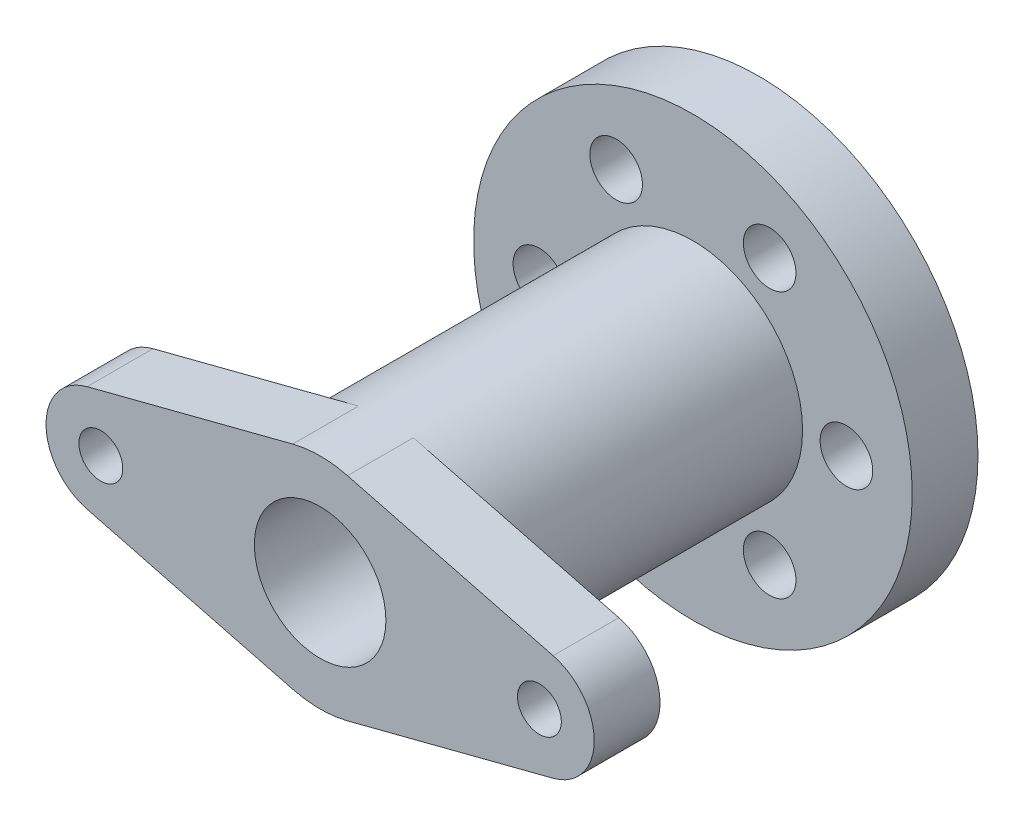
ISO-10303-21;
HEADER;
FILE_DESCRIPTION(('STEP AP214'),'2;1');
FILE_NAME('part.step','',(''),(''),'','','');
FILE_SCHEMA(('AUTOMOTIVE_DESIGN { 1 0 10303 214 1 1 1 1 }'));
ENDSEC;
DATA;
#1=APPLICATION_CONTEXT('core data for automotive mechanical design processes');
#2=APPLICATION_PROTOCOL_DEFINITION('international standard','automotive_design',2000,#1);
#3=PRODUCT_CONTEXT('',#1,'mechanical');
#4=PRODUCT('Part','Part','',(#3));
#5=PRODUCT_RELATED_PRODUCT_CATEGORY('part','',(#4));
#6=PRODUCT_DEFINITION_FORMATION('','',#4);
#7=PRODUCT_DEFINITION_CONTEXT('part definition',#1,'design');
#8=PRODUCT_DEFINITION('design','',#6,#7);
#9=PRODUCT_DEFINITION_SHAPE('','',#8);
#10=(LENGTH_UNIT() NAMED_UNIT(*) SI_UNIT(.MILLI.,.METRE.));
#11=(NAMED_UNIT(*) PLANE_ANGLE_UNIT() SI_UNIT($,.RADIAN.));
#12=(NAMED_UNIT(*) SI_UNIT($,.STERADIAN.) SOLID_ANGLE_UNIT());
#13=UNCERTAINTY_MEASURE_WITH_UNIT(LENGTH_MEASURE(1.E-05),#10,'distance_accuracy_value','');
#14=(GEOMETRIC_REPRESENTATION_CONTEXT(3) GLOBAL_UNCERTAINTY_ASSIGNED_CONTEXT((#13)) GLOBAL_UNIT_ASSIGNED_CONTEXT((#10,
#11,#12)) REPRESENTATION_CONTEXT('',''));
#15=CARTESIAN_POINT('',(0.,0.,0.));
#16=DIRECTION('',(0.,0.,1.));
#17=DIRECTION('',(1.,0.,0.));
#18=AXIS2_PLACEMENT_3D('',#15,#16,#17);
#19=CARTESIAN_POINT('',(0.,50.,-70.));
#20=DIRECTION('',(0.,0.,-1.));
#21=DIRECTION('',(-1.,0.,0.));
#22=AXIS2_PLACEMENT_3D('',#19,#20,#21);
#23=PLANE('',#22);
#24=CARTESIAN_POINT('',(35.,0.,-70.));
#25=DIRECTION('',(0.,0.,-1.));
#26=DIRECTION('',(-1.,0.,0.));
#27=AXIS2_PLACEMENT_3D('',#24,#25,#26);
#28=CIRCLE('',#27,6.);
#29=CARTESIAN_POINT('',(29.,0.,-70.));
#30=VERTEX_POINT('',#29);
#31=EDGE_CURVE('E451',#30,#30,#28,.F.);
#32=ORIENTED_EDGE('',*,*,#31,.F.);
#33=EDGE_LOOP('',(#32));
#34=FACE_BOUND('',#33,.T.);
#35=CARTESIAN_POINT('',(17.4999999999999,30.3108891324554,-70.));
#36=DIRECTION('',(0.,0.,-1.));
#37=DIRECTION('',(-1.,0.,0.));
#38=AXIS2_PLACEMENT_3D('',#35,#36,#37);
#39=CIRCLE('',#38,6.);
#40=CARTESIAN_POINT('',(11.4999999999999,30.3108891324554,-70.));
#41=VERTEX_POINT('',#40);
#42=EDGE_CURVE('E455',#41,#41,#39,.F.);
#43=ORIENTED_EDGE('',*,*,#42,.F.);
#44=EDGE_LOOP('',(#43));
#45=FACE_BOUND('',#44,.T.);
#46=CARTESIAN_POINT('',(-35.,-2.44403693719019E-13,-70.));
#47=DIRECTION('',(0.,0.,-1.));
#48=DIRECTION('',(-1.,0.,0.));
#49=AXIS2_PLACEMENT_3D('',#46,#47,#48);
#50=CIRCLE('',#49,6.);
#51=CARTESIAN_POINT('',(-41.,-2.44403693719019E-13,-70.));
#52=VERTEX_POINT('',#51);
#53=EDGE_CURVE('E463',#52,#52,#50,.F.);
#54=ORIENTED_EDGE('',*,*,#53,.F.);
#55=EDGE_LOOP('',(#54));
#56=FACE_BOUND('',#55,.T.);
#57=CARTESIAN_POINT('',(-17.4999999999997,-30.3108891324555,-70.));
#58=DIRECTION('',(0.,0.,-1.));
#59=DIRECTION('',(-1.,0.,0.));
#60=AXIS2_PLACEMENT_3D('',#57,#58,#59);
#61=CIRCLE('',#60,6.);
#62=CARTESIAN_POINT('',(-23.4999999999997,-30.3108891324555,-70.));
#63=VERTEX_POINT('',#62);
#64=EDGE_CURVE('E467',#63,#63,#61,.F.);
#65=ORIENTED_EDGE('',*,*,#64,.F.);
#66=EDGE_LOOP('',(#65));
#67=FACE_BOUND('',#66,.T.);
#68=CARTESIAN_POINT('',(17.5000000000004,-30.3108891324552,-70.));
#69=DIRECTION('',(0.,0.,-1.));
#70=DIRECTION('',(-1.,0.,0.));
#71=AXIS2_PLACEMENT_3D('',#68,#69,#70);
#72=CIRCLE('',#71,6.);
#73=CARTESIAN_POINT('',(11.5000000000004,-30.3108891324552,-70.));
#74=VERTEX_POINT('',#73);
#75=EDGE_CURVE('E195',#74,#74,#72,.F.);
#76=ORIENTED_EDGE('',*,*,#75,.F.);
#77=EDGE_LOOP('',(#76));
#78=FACE_BOUND('',#77,.T.);
#79=CARTESIAN_POINT('',(0.,0.,-70.));
#80=DIRECTION('',(0.,0.,1.));
#81=DIRECTION('',(1.,0.,0.));
#82=AXIS2_PLACEMENT_3D('',#79,#80,#81);
#83=CIRCLE('',#82,25.);
#84=CARTESIAN_POINT('',(25.,0.,-70.));
#85=VERTEX_POINT('',#84);
#86=EDGE_CURVE('E141',#85,#85,#83,.T.);
#87=ORIENTED_EDGE('',*,*,#86,.F.);
#88=EDGE_LOOP('',(#87));
#89=FACE_BOUND('',#88,.T.);
#90=CARTESIAN_POINT('',(0.,0.,-70.));
#91=DIRECTION('',(0.,0.,1.));
#92=DIRECTION('',(1.,0.,0.));
#93=AXIS2_PLACEMENT_3D('',#90,#91,#92);
#94=CIRCLE('',#93,50.);
#95=CARTESIAN_POINT('',(50.,0.,-70.));
#96=VERTEX_POINT('',#95);
#97=EDGE_CURVE('E53',#96,#96,#94,.T.);
#98=ORIENTED_EDGE('',*,*,#97,.T.);
#99=EDGE_LOOP('',(#98));
#100=FACE_BOUND('',#99,.T.);
#101=CARTESIAN_POINT('',(-17.5000000000001,30.3108891324553,-70.));
#102=DIRECTION('',(0.,0.,-1.));
#103=DIRECTION('',(-1.,0.,0.));
#104=AXIS2_PLACEMENT_3D('',#101,#102,#103);
#105=CIRCLE('',#104,6.);
#106=CARTESIAN_POINT('',(-23.5000000000001,30.3108891324553,-70.));
#107=VERTEX_POINT('',#106);
#108=EDGE_CURVE('E459',#107,#107,#105,.F.);
#109=ORIENTED_EDGE('',*,*,#108,.F.);
#110=EDGE_LOOP('',(#109));
#111=FACE_BOUND('',#110,.T.);
#112=ADVANCED_FACE('F45',(#34,#45,#56,#67,#78,#89,#100,#111),#23,.F.);
#113=CARTESIAN_POINT('',(0.,0.,-85.));
#114=DIRECTION('',(0.,0.,1.));
#115=DIRECTION('',(1.,0.,0.));
#116=AXIS2_PLACEMENT_3D('',#113,#114,#115);
#117=PLANE('',#116);
#118=CARTESIAN_POINT('',(35.,0.,-85.));
#119=DIRECTION('',(0.,0.,-1.));
#120=DIRECTION('',(-1.,0.,0.));
#121=AXIS2_PLACEMENT_3D('',#118,#119,#120);
#122=CIRCLE('',#121,6.);
#123=CARTESIAN_POINT('',(29.,0.,-85.));
#124=VERTEX_POINT('',#123);
#125=EDGE_CURVE('E163',#124,#124,#122,.T.);
#126=ORIENTED_EDGE('',*,*,#125,.F.);
#127=EDGE_LOOP('',(#126));
#128=FACE_BOUND('',#127,.T.);
#129=CARTESIAN_POINT('',(17.4999999999999,30.3108891324554,-85.));
#130=DIRECTION('',(0.,0.,-1.));
#131=DIRECTION('',(-1.,0.,0.));
#132=AXIS2_PLACEMENT_3D('',#129,#130,#131);
#133=CIRCLE('',#132,6.);
#134=CARTESIAN_POINT('',(11.4999999999999,30.3108891324554,-85.));
#135=VERTEX_POINT('',#134);
#136=EDGE_CURVE('E167',#135,#135,#133,.T.);
#137=ORIENTED_EDGE('',*,*,#136,.F.);
#138=EDGE_LOOP('',(#137));
#139=FACE_BOUND('',#138,.T.);
#140=CARTESIAN_POINT('',(-17.5000000000001,30.3108891324553,-85.));
#141=DIRECTION('',(0.,0.,-1.));
#142=DIRECTION('',(-1.,0.,0.));
#143=AXIS2_PLACEMENT_3D('',#140,#141,#142);
#144=CIRCLE('',#143,6.);
#145=CARTESIAN_POINT('',(-23.5000000000001,30.3108891324553,-85.));
#146=VERTEX_POINT('',#145);
#147=EDGE_CURVE('E171',#146,#146,#144,.T.);
#148=ORIENTED_EDGE('',*,*,#147,.F.);
#149=EDGE_LOOP('',(#148));
#150=FACE_BOUND('',#149,.T.);
#151=CARTESIAN_POINT('',(-35.,-2.44403693719019E-13,-85.));
#152=DIRECTION('',(0.,0.,-1.));
#153=DIRECTION('',(-1.,0.,0.));
#154=AXIS2_PLACEMENT_3D('',#151,#152,#153);
#155=CIRCLE('',#154,6.);
#156=CARTESIAN_POINT('',(-41.,-2.44403693719019E-13,-85.));
#157=VERTEX_POINT('',#156);
#158=EDGE_CURVE('E175',#157,#157,#155,.T.);
#159=ORIENTED_EDGE('',*,*,#158,.F.);
#160=EDGE_LOOP('',(#159));
#161=FACE_BOUND('',#160,.T.);
#162=CARTESIAN_POINT('',(-17.4999999999997,-30.3108891324555,-85.));
#163=DIRECTION('',(0.,0.,-1.));
#164=DIRECTION('',(-1.,0.,0.));
#165=AXIS2_PLACEMENT_3D('',#162,#163,#164);
#166=CIRCLE('',#165,6.);
#167=CARTESIAN_POINT('',(-23.4999999999997,-30.3108891324555,-85.));
#168=VERTEX_POINT('',#167);
#169=EDGE_CURVE('E179',#168,#168,#166,.T.);
#170=ORIENTED_EDGE('',*,*,#169,.F.);
#171=EDGE_LOOP('',(#170));
#172=FACE_BOUND('',#171,.T.);
#173=CARTESIAN_POINT('',(17.5000000000004,-30.3108891324552,-85.));
#174=DIRECTION('',(0.,0.,-1.));
#175=DIRECTION('',(-1.,0.,0.));
#176=AXIS2_PLACEMENT_3D('',#173,#174,#175);
#177=CIRCLE('',#176,6.);
#178=CARTESIAN_POINT('',(11.5000000000004,-30.3108891324552,-85.));
#179=VERTEX_POINT('',#178);
#180=EDGE_CURVE('E183',#179,#179,#177,.T.);
#181=ORIENTED_EDGE('',*,*,#180,.F.);
#182=EDGE_LOOP('',(#181));
#183=FACE_BOUND('',#182,.T.);
#184=CARTESIAN_POINT('',(0.,0.,-85.));
#185=DIRECTION('',(0.,0.,1.));
#186=DIRECTION('',(1.,0.,0.));
#187=AXIS2_PLACEMENT_3D('',#184,#185,#186);
#188=CIRCLE('',#187,15.);
#189=CARTESIAN_POINT('',(15.,0.,-85.));
#190=VERTEX_POINT('',#189);
#191=EDGE_CURVE('E186',#190,#190,#188,.F.);
#192=ORIENTED_EDGE('',*,*,#191,.F.);
#193=EDGE_LOOP('',(#192));
#194=FACE_BOUND('',#193,.T.);
#195=CARTESIAN_POINT('',(0.,0.,-85.));
#196=DIRECTION('',(0.,0.,1.));
#197=DIRECTION('',(1.,0.,0.));
#198=AXIS2_PLACEMENT_3D('',#195,#196,#197);
#199=CIRCLE('',#198,50.);
#200=CARTESIAN_POINT('',(50.,0.,-85.));
#201=VERTEX_POINT('',#200);
#202=EDGE_CURVE('E13',#201,#201,#199,.T.);
#203=ORIENTED_EDGE('',*,*,#202,.F.);
#204=EDGE_LOOP('',(#203));
#205=FACE_BOUND('',#204,.T.);
#206=ADVANCED_FACE('F47',(#128,#139,#150,#161,#172,#183,#194,#205),#117,.F.);
#207=CARTESIAN_POINT('',(0.,0.,0.));
#208=DIRECTION('',(0.,0.,1.));
#209=DIRECTION('',(1.,0.,0.));
#210=AXIS2_PLACEMENT_3D('',#207,#208,#209);
#211=CYLINDRICAL_SURFACE('',#210,50.);
#212=ORIENTED_EDGE('',*,*,#97,.F.);
#213=EDGE_LOOP('',(#212));
#214=FACE_BOUND('',#213,.T.);
#215=ORIENTED_EDGE('',*,*,#202,.T.);
#216=EDGE_LOOP('',(#215));
#217=FACE_BOUND('',#216,.T.);
#218=ADVANCED_FACE('F148',(#214,#217),#211,.T.);
#219=CARTESIAN_POINT('',(0.,0.,0.));
#220=DIRECTION('',(0.,0.,1.));
#221=DIRECTION('',(1.,0.,0.));
#222=AXIS2_PLACEMENT_3D('',#219,#220,#221);
#223=CYLINDRICAL_SURFACE('',#222,25.);
#224=CARTESIAN_POINT('',(0.,0.,0.));
#225=DIRECTION('',(0.,0.,1.));
#226=DIRECTION('',(1.,0.,0.));
#227=AXIS2_PLACEMENT_3D('',#224,#225,#226);
#228=CIRCLE('',#227,25.);
#229=CARTESIAN_POINT('',(-6.24999999999999,24.2061459137963,0.));
#230=VERTEX_POINT('',#229);
#231=CARTESIAN_POINT('',(-6.24999999999999,-24.2061459137963,0.));
#232=VERTEX_POINT('',#231);
#233=EDGE_CURVE('E68',#230,#232,#228,.T.);
#234=ORIENTED_EDGE('',*,*,#233,.F.);
#235=DIRECTION('',(0.,0.,-1.));
#236=VECTOR('',#235,1.);
#237=CARTESIAN_POINT('',(-6.25,24.2061459137963,15.));
#238=LINE('',#237,#236);
#239=CARTESIAN_POINT('',(-6.25,24.2061459137963,15.));
#240=VERTEX_POINT('',#239);
#241=EDGE_CURVE('E116',#240,#230,#238,.T.);
#242=ORIENTED_EDGE('',*,*,#241,.F.);
#243=CARTESIAN_POINT('',(0.,0.,15.));
#244=DIRECTION('',(0.,0.,1.));
#245=DIRECTION('',(1.,0.,0.));
#246=AXIS2_PLACEMENT_3D('',#243,#244,#245);
#247=CIRCLE('',#246,25.);
#248=CARTESIAN_POINT('',(6.25,24.2061459137963,15.));
#249=VERTEX_POINT('',#248);
#250=EDGE_CURVE('E122',#249,#240,#247,.T.);
#251=ORIENTED_EDGE('',*,*,#250,.F.);
#252=DIRECTION('',(0.,0.,-1.));
#253=VECTOR('',#252,1.);
#254=CARTESIAN_POINT('',(6.25,24.2061459137963,15.));
#255=LINE('',#254,#253);
#256=CARTESIAN_POINT('',(6.25,24.2061459137963,0.));
#257=VERTEX_POINT('',#256);
#258=EDGE_CURVE('E218',#249,#257,#255,.T.);
#259=ORIENTED_EDGE('',*,*,#258,.T.);
#260=CARTESIAN_POINT('',(6.24999999999999,-24.2061459137963,0.));
#261=VERTEX_POINT('',#260);
#262=EDGE_CURVE('E60',#261,#257,#228,.T.);
#263=ORIENTED_EDGE('',*,*,#262,.F.);
#264=DIRECTION('',(0.,0.,-1.));
#265=VECTOR('',#264,1.);
#266=CARTESIAN_POINT('',(6.25,-24.2061459137963,15.));
#267=LINE('',#266,#265);
#268=CARTESIAN_POINT('',(6.25,-24.2061459137963,15.));
#269=VERTEX_POINT('',#268);
#270=EDGE_CURVE('E237',#269,#261,#267,.T.);
#271=ORIENTED_EDGE('',*,*,#270,.F.);
#272=CARTESIAN_POINT('',(0.,0.,15.));
#273=DIRECTION('',(0.,0.,1.));
#274=DIRECTION('',(1.,0.,0.));
#275=AXIS2_PLACEMENT_3D('',#272,#273,#274);
#276=CIRCLE('',#275,25.);
#277=CARTESIAN_POINT('',(-6.25,-24.2061459137963,15.));
#278=VERTEX_POINT('',#277);
#279=EDGE_CURVE('E211',#278,#269,#276,.T.);
#280=ORIENTED_EDGE('',*,*,#279,.F.);
#281=DIRECTION('',(0.,0.,-1.));
#282=VECTOR('',#281,1.);
#283=CARTESIAN_POINT('',(-6.25,-24.2061459137963,15.));
#284=LINE('',#283,#282);
#285=EDGE_CURVE('E239',#278,#232,#284,.T.);
#286=ORIENTED_EDGE('',*,*,#285,.T.);
#287=EDGE_LOOP('',(#234,#242,#251,#259,#263,#271,#280,#286));
#288=FACE_BOUND('',#287,.T.);
#289=ORIENTED_EDGE('',*,*,#86,.T.);
#290=EDGE_LOOP('',(#289));
#291=FACE_BOUND('',#290,.T.);
#292=ADVANCED_FACE('F132',(#288,#291),#223,.T.);
#293=CARTESIAN_POINT('',(0.,0.,0.));
#294=DIRECTION('',(0.,0.,1.));
#295=DIRECTION('',(1.,0.,0.));
#296=AXIS2_PLACEMENT_3D('',#293,#294,#295);
#297=PLANE('',#296);
#298=CARTESIAN_POINT('',(-50.,0.,0.));
#299=DIRECTION('',(0.,0.,1.));
#300=DIRECTION('',(1.,0.,0.));
#301=AXIS2_PLACEMENT_3D('',#298,#299,#300);
#302=CIRCLE('',#301,5.);
#303=CARTESIAN_POINT('',(-45.,0.,0.));
#304=VERTEX_POINT('',#303);
#305=EDGE_CURVE('E200',#304,#304,#302,.T.);
#306=ORIENTED_EDGE('',*,*,#305,.T.);
#307=EDGE_LOOP('',(#306));
#308=FACE_BOUND('',#307,.T.);
#309=DIRECTION('',(-0.968245836551854,-0.25,0.));
#310=VECTOR('',#309,1.);
#311=CARTESIAN_POINT('',(-6.25,24.2061459137963,0.));
#312=LINE('',#311,#310);
#313=CARTESIAN_POINT('',(-53.125,12.1030729568982,0.));
#314=VERTEX_POINT('',#313);
#315=EDGE_CURVE('E205',#230,#314,#312,.T.);
#316=ORIENTED_EDGE('',*,*,#315,.F.);
#317=ORIENTED_EDGE('',*,*,#233,.T.);
#318=DIRECTION('',(0.968245836551854,-0.25,0.));
#319=VECTOR('',#318,1.);
#320=CARTESIAN_POINT('',(-6.25,-24.2061459137963,0.));
#321=LINE('',#320,#319);
#322=CARTESIAN_POINT('',(-53.125,-12.1030729568982,0.));
#323=VERTEX_POINT('',#322);
#324=EDGE_CURVE('E222',#323,#232,#321,.T.);
#325=ORIENTED_EDGE('',*,*,#324,.F.);
#326=CARTESIAN_POINT('',(-50.,0.,0.));
#327=DIRECTION('',(0.,0.,1.));
#328=DIRECTION('',(1.,0.,0.));
#329=AXIS2_PLACEMENT_3D('',#326,#327,#328);
#330=CIRCLE('',#329,12.5);
#331=EDGE_CURVE('E220',#314,#323,#330,.T.);
#332=ORIENTED_EDGE('',*,*,#331,.F.);
#333=EDGE_LOOP('',(#316,#317,#325,#332));
#334=FACE_BOUND('',#333,.T.);
#335=ADVANCED_FACE('F248',(#308,#334),#297,.F.);
#336=CARTESIAN_POINT('',(50.,0.,0.));
#337=DIRECTION('',(0.,0.,1.));
#338=DIRECTION('',(1.,0.,0.));
#339=AXIS2_PLACEMENT_3D('',#336,#337,#338);
#340=CIRCLE('',#339,5.);
#341=CARTESIAN_POINT('',(55.,0.,0.));
#342=VERTEX_POINT('',#341);
#343=EDGE_CURVE('E188',#342,#342,#340,.T.);
#344=ORIENTED_EDGE('',*,*,#343,.T.);
#345=EDGE_LOOP('',(#344));
#346=FACE_BOUND('',#345,.T.);
#347=DIRECTION('',(0.968245836551854,0.25,0.));
#348=VECTOR('',#347,1.);
#349=CARTESIAN_POINT('',(6.25,-24.2061459137963,0.));
#350=LINE('',#349,#348);
#351=CARTESIAN_POINT('',(53.125,-12.1030729568982,0.));
#352=VERTEX_POINT('',#351);
#353=EDGE_CURVE('E224',#261,#352,#350,.T.);
#354=ORIENTED_EDGE('',*,*,#353,.F.);
#355=ORIENTED_EDGE('',*,*,#262,.T.);
#356=DIRECTION('',(-0.968245836551854,0.25,0.));
#357=VECTOR('',#356,1.);
#358=CARTESIAN_POINT('',(6.25,24.2061459137963,0.));
#359=LINE('',#358,#357);
#360=CARTESIAN_POINT('',(53.125,12.1030729568982,0.));
#361=VERTEX_POINT('',#360);
#362=EDGE_CURVE('E130',#361,#257,#359,.T.);
#363=ORIENTED_EDGE('',*,*,#362,.F.);
#364=CARTESIAN_POINT('',(50.,0.,0.));
#365=DIRECTION('',(0.,0.,1.));
#366=DIRECTION('',(1.,0.,0.));
#367=AXIS2_PLACEMENT_3D('',#364,#365,#366);
#368=CIRCLE('',#367,12.5);
#369=EDGE_CURVE('E226',#352,#361,#368,.T.);
#370=ORIENTED_EDGE('',*,*,#369,.F.);
#371=EDGE_LOOP('',(#354,#355,#363,#370));
#372=FACE_BOUND('',#371,.T.);
#373=ADVANCED_FACE('F265',(#346,#372),#297,.F.);
#374=CARTESIAN_POINT('',(0.,0.,15.));
#375=DIRECTION('',(0.,0.,1.));
#376=DIRECTION('',(1.,0.,0.));
#377=AXIS2_PLACEMENT_3D('',#374,#375,#376);
#378=PLANE('',#377);
#379=CARTESIAN_POINT('',(0.,0.,15.));
#380=DIRECTION('',(0.,0.,1.));
#381=DIRECTION('',(1.,0.,0.));
#382=AXIS2_PLACEMENT_3D('',#379,#380,#381);
#383=CIRCLE('',#382,15.);
#384=CARTESIAN_POINT('',(15.,0.,15.));
#385=VERTEX_POINT('',#384);
#386=EDGE_CURVE('E189',#385,#385,#383,.T.);
#387=ORIENTED_EDGE('',*,*,#386,.F.);
#388=EDGE_LOOP('',(#387));
#389=FACE_BOUND('',#388,.T.);
#390=CARTESIAN_POINT('',(-50.,0.,15.));
#391=DIRECTION('',(0.,0.,1.));
#392=DIRECTION('',(1.,0.,0.));
#393=AXIS2_PLACEMENT_3D('',#390,#391,#392);
#394=CIRCLE('',#393,5.);
#395=CARTESIAN_POINT('',(-45.,0.,15.));
#396=VERTEX_POINT('',#395);
#397=EDGE_CURVE('E202',#396,#396,#394,.T.);
#398=ORIENTED_EDGE('',*,*,#397,.F.);
#399=EDGE_LOOP('',(#398));
#400=FACE_BOUND('',#399,.T.);
#401=ORIENTED_EDGE('',*,*,#250,.T.);
#402=DIRECTION('',(-0.968245836551854,-0.25,0.));
#403=VECTOR('',#402,1.);
#404=CARTESIAN_POINT('',(-6.25,24.2061459137963,15.));
#405=LINE('',#404,#403);
#406=CARTESIAN_POINT('',(-53.125,12.1030729568982,15.));
#407=VERTEX_POINT('',#406);
#408=EDGE_CURVE('E112',#240,#407,#405,.T.);
#409=ORIENTED_EDGE('',*,*,#408,.T.);
#410=CARTESIAN_POINT('',(-50.,0.,15.));
#411=DIRECTION('',(0.,0.,1.));
#412=DIRECTION('',(1.,0.,0.));
#413=AXIS2_PLACEMENT_3D('',#410,#411,#412);
#414=CIRCLE('',#413,12.5);
#415=CARTESIAN_POINT('',(-53.125,-12.1030729568982,15.));
#416=VERTEX_POINT('',#415);
#417=EDGE_CURVE('E121',#407,#416,#414,.T.);
#418=ORIENTED_EDGE('',*,*,#417,.T.);
#419=DIRECTION('',(0.968245836551854,-0.25,0.));
#420=VECTOR('',#419,1.);
#421=CARTESIAN_POINT('',(-6.25,-24.2061459137963,15.));
#422=LINE('',#421,#420);
#423=EDGE_CURVE('E209',#416,#278,#422,.T.);
#424=ORIENTED_EDGE('',*,*,#423,.T.);
#425=ORIENTED_EDGE('',*,*,#279,.T.);
#426=DIRECTION('',(0.968245836551854,0.25,0.));
#427=VECTOR('',#426,1.);
#428=CARTESIAN_POINT('',(6.25,-24.2061459137963,15.));
#429=LINE('',#428,#427);
#430=CARTESIAN_POINT('',(53.125,-12.1030729568982,15.));
#431=VERTEX_POINT('',#430);
#432=EDGE_CURVE('E213',#269,#431,#429,.T.);
#433=ORIENTED_EDGE('',*,*,#432,.T.);
#434=CARTESIAN_POINT('',(50.,0.,15.));
#435=DIRECTION('',(0.,0.,1.));
#436=DIRECTION('',(1.,0.,0.));
#437=AXIS2_PLACEMENT_3D('',#434,#435,#436);
#438=CIRCLE('',#437,12.5);
#439=CARTESIAN_POINT('',(53.125,12.1030729568982,15.));
#440=VERTEX_POINT('',#439);
#441=EDGE_CURVE('E215',#431,#440,#438,.T.);
#442=ORIENTED_EDGE('',*,*,#441,.T.);
#443=DIRECTION('',(-0.968245836551854,0.25,0.));
#444=VECTOR('',#443,1.);
#445=CARTESIAN_POINT('',(6.25,24.2061459137963,15.));
#446=LINE('',#445,#444);
#447=EDGE_CURVE('E128',#440,#249,#446,.T.);
#448=ORIENTED_EDGE('',*,*,#447,.T.);
#449=EDGE_LOOP('',(#401,#409,#418,#424,#425,#433,#442,#448));
#450=FACE_BOUND('',#449,.T.);
#451=CARTESIAN_POINT('',(50.,0.,15.));
#452=DIRECTION('',(0.,0.,1.));
#453=DIRECTION('',(1.,0.,0.));
#454=AXIS2_PLACEMENT_3D('',#451,#452,#453);
#455=CIRCLE('',#454,5.);
#456=CARTESIAN_POINT('',(55.,0.,15.));
#457=VERTEX_POINT('',#456);
#458=EDGE_CURVE('E192',#457,#457,#455,.T.);
#459=ORIENTED_EDGE('',*,*,#458,.F.);
#460=EDGE_LOOP('',(#459));
#461=FACE_BOUND('',#460,.T.);
#462=ADVANCED_FACE('F125',(#389,#400,#450,#461),#378,.T.);
#463=CARTESIAN_POINT('',(-6.25,24.2061459137963,15.));
#464=DIRECTION('',(0.25,-0.968245836551854,0.));
#465=DIRECTION('',(0.968245836551854,0.25,0.));
#466=AXIS2_PLACEMENT_3D('',#463,#464,#465);
#467=PLANE('',#466);
#468=ORIENTED_EDGE('',*,*,#315,.T.);
#469=DIRECTION('',(0.,0.,-1.));
#470=VECTOR('',#469,1.);
#471=CARTESIAN_POINT('',(-53.125,12.1030729568982,15.));
#472=LINE('',#471,#470);
#473=EDGE_CURVE('E118',#407,#314,#472,.T.);
#474=ORIENTED_EDGE('',*,*,#473,.F.);
#475=ORIENTED_EDGE('',*,*,#408,.F.);
#476=ORIENTED_EDGE('',*,*,#241,.T.);
#477=EDGE_LOOP('',(#468,#474,#475,#476));
#478=FACE_BOUND('',#477,.T.);
#479=ADVANCED_FACE('F114',(#478),#467,.F.);
#480=CARTESIAN_POINT('',(-50.,0.,15.));
#481=DIRECTION('',(0.,0.,-1.));
#482=DIRECTION('',(-1.,0.,0.));
#483=AXIS2_PLACEMENT_3D('',#480,#481,#482);
#484=CYLINDRICAL_SURFACE('',#483,12.5);
#485=ORIENTED_EDGE('',*,*,#331,.T.);
#486=DIRECTION('',(0.,0.,-1.));
#487=VECTOR('',#486,1.);
#488=CARTESIAN_POINT('',(-53.125,-12.1030729568982,15.));
#489=LINE('',#488,#487);
#490=EDGE_CURVE('E137',#416,#323,#489,.T.);
#491=ORIENTED_EDGE('',*,*,#490,.F.);
#492=ORIENTED_EDGE('',*,*,#417,.F.);
#493=ORIENTED_EDGE('',*,*,#473,.T.);
#494=EDGE_LOOP('',(#485,#491,#492,#493));
#495=FACE_BOUND('',#494,.T.);
#496=ADVANCED_FACE('F249',(#495),#484,.T.);
#497=CARTESIAN_POINT('',(-6.25,-24.2061459137963,15.));
#498=DIRECTION('',(0.25,0.968245836551854,0.));
#499=DIRECTION('',(-0.968245836551854,0.25,0.));
#500=AXIS2_PLACEMENT_3D('',#497,#498,#499);
#501=PLANE('',#500);
#502=ORIENTED_EDGE('',*,*,#324,.T.);
#503=ORIENTED_EDGE('',*,*,#285,.F.);
#504=ORIENTED_EDGE('',*,*,#423,.F.);
#505=ORIENTED_EDGE('',*,*,#490,.T.);
#506=EDGE_LOOP('',(#502,#503,#504,#505));
#507=FACE_BOUND('',#506,.T.);
#508=ADVANCED_FACE('F244',(#507),#501,.F.);
#509=CARTESIAN_POINT('',(6.25,-24.2061459137963,15.));
#510=DIRECTION('',(-0.25,0.968245836551854,0.));
#511=DIRECTION('',(-0.968245836551854,-0.25,0.));
#512=AXIS2_PLACEMENT_3D('',#509,#510,#511);
#513=PLANE('',#512);
#514=ORIENTED_EDGE('',*,*,#353,.T.);
#515=DIRECTION('',(0.,0.,-1.));
#516=VECTOR('',#515,1.);
#517=CARTESIAN_POINT('',(53.125,-12.1030729568982,15.));
#518=LINE('',#517,#516);
#519=EDGE_CURVE('E234',#431,#352,#518,.T.);
#520=ORIENTED_EDGE('',*,*,#519,.F.);
#521=ORIENTED_EDGE('',*,*,#432,.F.);
#522=ORIENTED_EDGE('',*,*,#270,.T.);
#523=EDGE_LOOP('',(#514,#520,#521,#522));
#524=FACE_BOUND('',#523,.T.);
#525=ADVANCED_FACE('F255',(#524),#513,.F.);
#526=CARTESIAN_POINT('',(50.,0.,15.));
#527=DIRECTION('',(0.,0.,-1.));
#528=DIRECTION('',(-1.,0.,0.));
#529=AXIS2_PLACEMENT_3D('',#526,#527,#528);
#530=CYLINDRICAL_SURFACE('',#529,12.5);
#531=ORIENTED_EDGE('',*,*,#369,.T.);
#532=DIRECTION('',(0.,0.,-1.));
#533=VECTOR('',#532,1.);
#534=CARTESIAN_POINT('',(53.125,12.1030729568982,15.));
#535=LINE('',#534,#533);
#536=EDGE_CURVE('E231',#440,#361,#535,.T.);
#537=ORIENTED_EDGE('',*,*,#536,.F.);
#538=ORIENTED_EDGE('',*,*,#441,.F.);
#539=ORIENTED_EDGE('',*,*,#519,.T.);
#540=EDGE_LOOP('',(#531,#537,#538,#539));
#541=FACE_BOUND('',#540,.T.);
#542=ADVANCED_FACE('F259',(#541),#530,.T.);
#543=CARTESIAN_POINT('',(6.25,24.2061459137963,15.));
#544=DIRECTION('',(-0.25,-0.968245836551854,0.));
#545=DIRECTION('',(0.968245836551854,-0.25,0.));
#546=AXIS2_PLACEMENT_3D('',#543,#544,#545);
#547=PLANE('',#546);
#548=ORIENTED_EDGE('',*,*,#362,.T.);
#549=ORIENTED_EDGE('',*,*,#258,.F.);
#550=ORIENTED_EDGE('',*,*,#447,.F.);
#551=ORIENTED_EDGE('',*,*,#536,.T.);
#552=EDGE_LOOP('',(#548,#549,#550,#551));
#553=FACE_BOUND('',#552,.T.);
#554=ADVANCED_FACE('F263',(#553),#547,.F.);
#555=CARTESIAN_POINT('',(-50.,0.,15.));
#556=DIRECTION('',(0.,0.,-1.));
#557=DIRECTION('',(-1.,0.,0.));
#558=AXIS2_PLACEMENT_3D('',#555,#556,#557);
#559=CYLINDRICAL_SURFACE('',#558,5.);
#560=ORIENTED_EDGE('',*,*,#397,.T.);
#561=EDGE_LOOP('',(#560));
#562=FACE_BOUND('',#561,.T.);
#563=ORIENTED_EDGE('',*,*,#305,.F.);
#564=EDGE_LOOP('',(#563));
#565=FACE_BOUND('',#564,.T.);
#566=ADVANCED_FACE('F280',(#562,#565),#559,.F.);
#567=CARTESIAN_POINT('',(50.,0.,15.));
#568=DIRECTION('',(0.,0.,-1.));
#569=DIRECTION('',(-1.,0.,0.));
#570=AXIS2_PLACEMENT_3D('',#567,#568,#569);
#571=CYLINDRICAL_SURFACE('',#570,5.);
#572=ORIENTED_EDGE('',*,*,#458,.T.);
#573=EDGE_LOOP('',(#572));
#574=FACE_BOUND('',#573,.T.);
#575=ORIENTED_EDGE('',*,*,#343,.F.);
#576=EDGE_LOOP('',(#575));
#577=FACE_BOUND('',#576,.T.);
#578=ADVANCED_FACE('F350',(#574,#577),#571,.F.);
#579=CARTESIAN_POINT('',(0.,0.,-127.426406871193));
#580=DIRECTION('',(0.,0.,1.));
#581=DIRECTION('',(1.,0.,0.));
#582=AXIS2_PLACEMENT_3D('',#579,#580,#581);
#583=CYLINDRICAL_SURFACE('',#582,15.);
#584=ORIENTED_EDGE('',*,*,#191,.T.);
#585=EDGE_LOOP('',(#584));
#586=FACE_BOUND('',#585,.T.);
#587=ORIENTED_EDGE('',*,*,#386,.T.);
#588=EDGE_LOOP('',(#587));
#589=FACE_BOUND('',#588,.T.);
#590=ADVANCED_FACE('F359',(#586,#589),#583,.F.);
#591=CARTESIAN_POINT('',(17.5000000000004,-30.3108891324552,-85.));
#592=DIRECTION('',(0.,0.,-1.));
#593=DIRECTION('',(-1.,0.,0.));
#594=AXIS2_PLACEMENT_3D('',#591,#592,#593);
#595=CYLINDRICAL_SURFACE('',#594,6.);
#596=ORIENTED_EDGE('',*,*,#75,.T.);
#597=EDGE_LOOP('',(#596));
#598=FACE_BOUND('',#597,.T.);
#599=ORIENTED_EDGE('',*,*,#180,.T.);
#600=EDGE_LOOP('',(#599));
#601=FACE_BOUND('',#600,.T.);
#602=ADVANCED_FACE('F374',(#598,#601),#595,.F.);
#603=CARTESIAN_POINT('',(-17.4999999999997,-30.3108891324555,-85.));
#604=DIRECTION('',(0.,0.,-1.));
#605=DIRECTION('',(-1.,0.,0.));
#606=AXIS2_PLACEMENT_3D('',#603,#604,#605);
#607=CYLINDRICAL_SURFACE('',#606,6.);
#608=ORIENTED_EDGE('',*,*,#64,.T.);
#609=EDGE_LOOP('',(#608));
#610=FACE_BOUND('',#609,.T.);
#611=ORIENTED_EDGE('',*,*,#169,.T.);
#612=EDGE_LOOP('',(#611));
#613=FACE_BOUND('',#612,.T.);
#614=ADVANCED_FACE('F394',(#610,#613),#607,.F.);
#615=CARTESIAN_POINT('',(-35.,-2.44403693719019E-13,-85.));
#616=DIRECTION('',(0.,0.,-1.));
#617=DIRECTION('',(-1.,0.,0.));
#618=AXIS2_PLACEMENT_3D('',#615,#616,#617);
#619=CYLINDRICAL_SURFACE('',#618,6.);
#620=ORIENTED_EDGE('',*,*,#53,.T.);
#621=EDGE_LOOP('',(#620));
#622=FACE_BOUND('',#621,.T.);
#623=ORIENTED_EDGE('',*,*,#158,.T.);
#624=EDGE_LOOP('',(#623));
#625=FACE_BOUND('',#624,.T.);
#626=ADVANCED_FACE('F404',(#622,#625),#619,.F.);
#627=CARTESIAN_POINT('',(-17.5000000000001,30.3108891324553,-85.));
#628=DIRECTION('',(0.,0.,-1.));
#629=DIRECTION('',(-1.,0.,0.));
#630=AXIS2_PLACEMENT_3D('',#627,#628,#629);
#631=CYLINDRICAL_SURFACE('',#630,6.);
#632=ORIENTED_EDGE('',*,*,#108,.T.);
#633=EDGE_LOOP('',(#632));
#634=FACE_BOUND('',#633,.T.);
#635=ORIENTED_EDGE('',*,*,#147,.T.);
#636=EDGE_LOOP('',(#635));
#637=FACE_BOUND('',#636,.T.);
#638=ADVANCED_FACE('F414',(#634,#637),#631,.F.);
#639=CARTESIAN_POINT('',(17.4999999999999,30.3108891324554,-85.));
#640=DIRECTION('',(0.,0.,-1.));
#641=DIRECTION('',(-1.,0.,0.));
#642=AXIS2_PLACEMENT_3D('',#639,#640,#641);
#643=CYLINDRICAL_SURFACE('',#642,6.);
#644=ORIENTED_EDGE('',*,*,#42,.T.);
#645=EDGE_LOOP('',(#644));
#646=FACE_BOUND('',#645,.T.);
#647=ORIENTED_EDGE('',*,*,#136,.T.);
#648=EDGE_LOOP('',(#647));
#649=FACE_BOUND('',#648,.T.);
#650=ADVANCED_FACE('F424',(#646,#649),#643,.F.);
#651=CARTESIAN_POINT('',(35.,0.,-85.));
#652=DIRECTION('',(0.,0.,-1.));
#653=DIRECTION('',(-1.,0.,0.));
#654=AXIS2_PLACEMENT_3D('',#651,#652,#653);
#655=CYLINDRICAL_SURFACE('',#654,6.);
#656=ORIENTED_EDGE('',*,*,#31,.T.);
#657=EDGE_LOOP('',(#656));
#658=FACE_BOUND('',#657,.T.);
#659=ORIENTED_EDGE('',*,*,#125,.T.);
#660=EDGE_LOOP('',(#659));
#661=FACE_BOUND('',#660,.T.);
#662=ADVANCED_FACE('F434',(#658,#661),#655,.F.);
#663=CLOSED_SHELL('',(#112,#206,#218,#292,#335,#373,#462,#479,#496,#508,#525,#542,#554,#566,
#578,#590,#602,#614,#626,#638,#650,#662));
#664=MANIFOLD_SOLID_BREP('B2',#663);
#665=ADVANCED_BREP_SHAPE_REPRESENTATION('',(#18,#664),#14);
#666=SHAPE_DEFINITION_REPRESENTATION(#9,#665);
ENDSEC;
END-ISO-10303-21;
